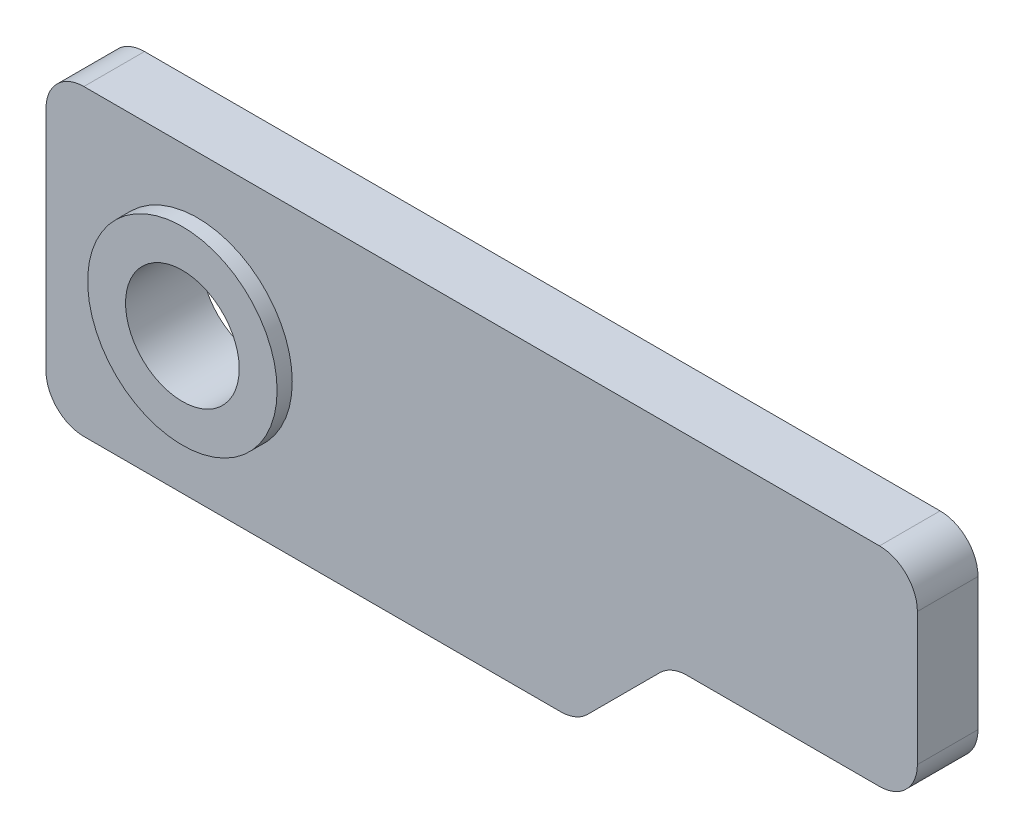
ISO-10303-21;
HEADER;
FILE_DESCRIPTION(('STEP AP214'),'2;1');
FILE_NAME('part.step','',(''),(''),'','','');
FILE_SCHEMA(('AUTOMOTIVE_DESIGN { 1 0 10303 214 1 1 1 1 }'));
ENDSEC;
DATA;
#1=APPLICATION_CONTEXT('core data for automotive mechanical design processes');
#2=APPLICATION_PROTOCOL_DEFINITION('international standard','automotive_design',2000,#1);
#3=PRODUCT_CONTEXT('',#1,'mechanical');
#4=PRODUCT('Part','Part','',(#3));
#5=PRODUCT_RELATED_PRODUCT_CATEGORY('part','',(#4));
#6=PRODUCT_DEFINITION_FORMATION('','',#4);
#7=PRODUCT_DEFINITION_CONTEXT('part definition',#1,'design');
#8=PRODUCT_DEFINITION('design','',#6,#7);
#9=PRODUCT_DEFINITION_SHAPE('','',#8);
#10=(LENGTH_UNIT() NAMED_UNIT(*) SI_UNIT(.MILLI.,.METRE.));
#11=(NAMED_UNIT(*) PLANE_ANGLE_UNIT() SI_UNIT($,.RADIAN.));
#12=(NAMED_UNIT(*) SI_UNIT($,.STERADIAN.) SOLID_ANGLE_UNIT());
#13=UNCERTAINTY_MEASURE_WITH_UNIT(LENGTH_MEASURE(1.E-05),#10,'distance_accuracy_value','');
#14=(GEOMETRIC_REPRESENTATION_CONTEXT(3) GLOBAL_UNCERTAINTY_ASSIGNED_CONTEXT((#13)) GLOBAL_UNIT_ASSIGNED_CONTEXT((#10,
#11,#12)) REPRESENTATION_CONTEXT('',''));
#15=CARTESIAN_POINT('',(0.,0.,0.));
#16=DIRECTION('',(0.,0.,1.));
#17=DIRECTION('',(1.,0.,0.));
#18=AXIS2_PLACEMENT_3D('',#15,#16,#17);
#19=CARTESIAN_POINT('',(0.,0.,2.));
#20=DIRECTION('',(0.,0.,1.));
#21=DIRECTION('',(1.,0.,0.));
#22=AXIS2_PLACEMENT_3D('',#19,#20,#21);
#23=PLANE('',#22);
#24=CARTESIAN_POINT('',(-7.5,0.,2.));
#25=DIRECTION('',(0.,0.,1.));
#26=DIRECTION('',(1.,0.,0.));
#27=AXIS2_PLACEMENT_3D('',#24,#25,#26);
#28=CIRCLE('',#27,1.5);
#29=CARTESIAN_POINT('',(-6.,0.,2.));
#30=VERTEX_POINT('',#29);
#31=EDGE_CURVE('E218',#30,#30,#28,.T.);
#32=ORIENTED_EDGE('',*,*,#31,.F.);
#33=EDGE_LOOP('',(#32));
#34=FACE_BOUND('',#33,.T.);
#35=CARTESIAN_POINT('',(-7.5,0.,2.));
#36=DIRECTION('',(0.,0.,1.));
#37=DIRECTION('',(1.,0.,0.));
#38=AXIS2_PLACEMENT_3D('',#35,#36,#37);
#39=CIRCLE('',#38,2.5);
#40=CARTESIAN_POINT('',(-5.,0.,2.));
#41=VERTEX_POINT('',#40);
#42=EDGE_CURVE('E254',#41,#41,#39,.T.);
#43=ORIENTED_EDGE('',*,*,#42,.T.);
#44=EDGE_LOOP('',(#43));
#45=FACE_BOUND('',#44,.T.);
#46=ADVANCED_FACE('F37',(#34,#45),#23,.T.);
#47=CARTESIAN_POINT('',(-11.5,-4.,2.));
#48=DIRECTION('',(1.,0.,0.));
#49=DIRECTION('',(0.,0.,-1.));
#50=AXIS2_PLACEMENT_3D('',#47,#48,#49);
#51=PLANE('',#50);
#52=DIRECTION('',(0.,-1.,0.));
#53=VECTOR('',#52,1.);
#54=CARTESIAN_POINT('',(-11.5,-4.,0.));
#55=LINE('',#54,#53);
#56=CARTESIAN_POINT('',(-11.5,3.,0.));
#57=VERTEX_POINT('',#56);
#58=CARTESIAN_POINT('',(-11.5,-3.,0.));
#59=VERTEX_POINT('',#58);
#60=EDGE_CURVE('E221',#57,#59,#55,.T.);
#61=ORIENTED_EDGE('',*,*,#60,.T.);
#62=DIRECTION('',(0.,0.,-1.));
#63=VECTOR('',#62,1.);
#64=CARTESIAN_POINT('',(-11.5,-3.,2.));
#65=LINE('',#64,#63);
#66=CARTESIAN_POINT('',(-11.5,-3.,1.6));
#67=VERTEX_POINT('',#66);
#68=EDGE_CURVE('E193',#59,#67,#65,.F.);
#69=ORIENTED_EDGE('',*,*,#68,.T.);
#70=DIRECTION('',(0.,-1.,0.));
#71=VECTOR('',#70,1.);
#72=CARTESIAN_POINT('',(-11.5,4.,1.6));
#73=LINE('',#72,#71);
#74=CARTESIAN_POINT('',(-11.5,3.,1.6));
#75=VERTEX_POINT('',#74);
#76=EDGE_CURVE('E243',#75,#67,#73,.T.);
#77=ORIENTED_EDGE('',*,*,#76,.F.);
#78=DIRECTION('',(0.,0.,-1.));
#79=VECTOR('',#78,1.);
#80=CARTESIAN_POINT('',(-11.5,3.,2.));
#81=LINE('',#80,#79);
#82=EDGE_CURVE('E190',#75,#57,#81,.T.);
#83=ORIENTED_EDGE('',*,*,#82,.T.);
#84=EDGE_LOOP('',(#61,#69,#77,#83));
#85=FACE_BOUND('',#84,.T.);
#86=ADVANCED_FACE('F247',(#85),#51,.F.);
#87=CARTESIAN_POINT('',(2.50000000000001,-4.,2.));
#88=DIRECTION('',(0.,1.,0.));
#89=DIRECTION('',(-1.,0.,0.));
#90=AXIS2_PLACEMENT_3D('',#87,#88,#89);
#91=PLANE('',#90);
#92=DIRECTION('',(1.,0.,0.));
#93=VECTOR('',#92,1.);
#94=CARTESIAN_POINT('',(2.50000000000001,-4.,0.));
#95=LINE('',#94,#93);
#96=CARTESIAN_POINT('',(-10.5,-4.,0.));
#97=VERTEX_POINT('',#96);
#98=CARTESIAN_POINT('',(2.08578643762691,-4.,0.));
#99=VERTEX_POINT('',#98);
#100=EDGE_CURVE('E206',#97,#99,#95,.T.);
#101=ORIENTED_EDGE('',*,*,#100,.T.);
#102=DIRECTION('',(0.,0.,-1.));
#103=VECTOR('',#102,1.);
#104=CARTESIAN_POINT('',(2.08578643762691,-4.,2.));
#105=LINE('',#104,#103);
#106=CARTESIAN_POINT('',(2.08578643762691,-4.,1.6));
#107=VERTEX_POINT('',#106);
#108=EDGE_CURVE('E183',#99,#107,#105,.F.);
#109=ORIENTED_EDGE('',*,*,#108,.T.);
#110=DIRECTION('',(1.,0.,0.));
#111=VECTOR('',#110,1.);
#112=CARTESIAN_POINT('',(-11.5,-4.,1.6));
#113=LINE('',#112,#111);
#114=CARTESIAN_POINT('',(-10.5,-4.,1.6));
#115=VERTEX_POINT('',#114);
#116=EDGE_CURVE('E214',#115,#107,#113,.T.);
#117=ORIENTED_EDGE('',*,*,#116,.F.);
#118=DIRECTION('',(0.,0.,-1.));
#119=VECTOR('',#118,1.);
#120=CARTESIAN_POINT('',(-10.5,-4.,2.));
#121=LINE('',#120,#119);
#122=EDGE_CURVE('E180',#115,#97,#121,.T.);
#123=ORIENTED_EDGE('',*,*,#122,.T.);
#124=EDGE_LOOP('',(#101,#109,#117,#123));
#125=FACE_BOUND('',#124,.T.);
#126=ADVANCED_FACE('F279',(#125),#91,.F.);
#127=CARTESIAN_POINT('',(5.,-1.5,2.));
#128=DIRECTION('',(-0.707106781186549,0.707106781186546,0.));
#129=DIRECTION('',(-0.707106781186546,-0.707106781186549,0.));
#130=AXIS2_PLACEMENT_3D('',#127,#128,#129);
#131=PLANE('',#130);
#132=DIRECTION('',(0.707106781186546,0.707106781186549,0.));
#133=VECTOR('',#132,1.);
#134=CARTESIAN_POINT('',(5.,-1.5,0.));
#135=LINE('',#134,#133);
#136=CARTESIAN_POINT('',(2.79289321881346,-3.70710678118655,0.));
#137=VERTEX_POINT('',#136);
#138=CARTESIAN_POINT('',(4.70710678118655,-1.79289321881345,0.));
#139=VERTEX_POINT('',#138);
#140=EDGE_CURVE('E199',#137,#139,#135,.T.);
#141=ORIENTED_EDGE('',*,*,#140,.T.);
#142=DIRECTION('',(0.,0.,-1.));
#143=VECTOR('',#142,1.);
#144=CARTESIAN_POINT('',(4.70710678118655,-1.79289321881345,1.6));
#145=LINE('',#144,#143);
#146=CARTESIAN_POINT('',(4.70710678118655,-1.79289321881345,1.6));
#147=VERTEX_POINT('',#146);
#148=EDGE_CURVE('E52',#139,#147,#145,.F.);
#149=ORIENTED_EDGE('',*,*,#148,.T.);
#150=DIRECTION('',(0.707106781186546,0.707106781186549,0.));
#151=VECTOR('',#150,1.);
#152=CARTESIAN_POINT('',(2.50000000000001,-4.,1.6));
#153=LINE('',#152,#151);
#154=CARTESIAN_POINT('',(2.79289321881346,-3.70710678118655,1.6));
#155=VERTEX_POINT('',#154);
#156=EDGE_CURVE('E210',#155,#147,#153,.T.);
#157=ORIENTED_EDGE('',*,*,#156,.F.);
#158=DIRECTION('',(0.,0.,-1.));
#159=VECTOR('',#158,1.);
#160=CARTESIAN_POINT('',(2.79289321881346,-3.70710678118655,2.));
#161=LINE('',#160,#159);
#162=EDGE_CURVE('E137',#155,#137,#161,.T.);
#163=ORIENTED_EDGE('',*,*,#162,.T.);
#164=EDGE_LOOP('',(#141,#149,#157,#163));
#165=FACE_BOUND('',#164,.T.);
#166=ADVANCED_FACE('F204',(#165),#131,.F.);
#167=CARTESIAN_POINT('',(11.5,-1.5,2.));
#168=DIRECTION('',(0.,1.,0.));
#169=DIRECTION('',(-1.,0.,0.));
#170=AXIS2_PLACEMENT_3D('',#167,#168,#169);
#171=PLANE('',#170);
#172=DIRECTION('',(1.,0.,0.));
#173=VECTOR('',#172,1.);
#174=CARTESIAN_POINT('',(11.5,-1.5,0.));
#175=LINE('',#174,#173);
#176=CARTESIAN_POINT('',(5.41421356237309,-1.5,0.));
#177=VERTEX_POINT('',#176);
#178=CARTESIAN_POINT('',(10.5,-1.5,0.));
#179=VERTEX_POINT('',#178);
#180=EDGE_CURVE('E201',#177,#179,#175,.T.);
#181=ORIENTED_EDGE('',*,*,#180,.T.);
#182=DIRECTION('',(0.,0.,-1.));
#183=VECTOR('',#182,1.);
#184=CARTESIAN_POINT('',(10.5,-1.5,2.));
#185=LINE('',#184,#183);
#186=CARTESIAN_POINT('',(10.5,-1.5,1.6));
#187=VERTEX_POINT('',#186);
#188=EDGE_CURVE('E168',#179,#187,#185,.F.);
#189=ORIENTED_EDGE('',*,*,#188,.T.);
#190=DIRECTION('',(1.,0.,0.));
#191=VECTOR('',#190,1.);
#192=CARTESIAN_POINT('',(5.,-1.5,1.6));
#193=LINE('',#192,#191);
#194=CARTESIAN_POINT('',(5.41421356237309,-1.5,1.6));
#195=VERTEX_POINT('',#194);
#196=EDGE_CURVE('E133',#195,#187,#193,.T.);
#197=ORIENTED_EDGE('',*,*,#196,.F.);
#198=DIRECTION('',(0.,0.,-1.));
#199=VECTOR('',#198,1.);
#200=CARTESIAN_POINT('',(5.41421356237309,-1.5,0.));
#201=LINE('',#200,#199);
#202=EDGE_CURVE('E165',#195,#177,#201,.T.);
#203=ORIENTED_EDGE('',*,*,#202,.T.);
#204=EDGE_LOOP('',(#181,#189,#197,#203));
#205=FACE_BOUND('',#204,.T.);
#206=ADVANCED_FACE('F212',(#205),#171,.F.);
#207=CARTESIAN_POINT('',(11.5,-1.5,2.));
#208=DIRECTION('',(-1.,0.,0.));
#209=DIRECTION('',(0.,0.,1.));
#210=AXIS2_PLACEMENT_3D('',#207,#208,#209);
#211=PLANE('',#210);
#212=DIRECTION('',(0.,1.,0.));
#213=VECTOR('',#212,1.);
#214=CARTESIAN_POINT('',(11.5,-1.5,1.6));
#215=LINE('',#214,#213);
#216=CARTESIAN_POINT('',(11.5,-0.499999999999997,1.6));
#217=VERTEX_POINT('',#216);
#218=CARTESIAN_POINT('',(11.5,3.,1.6));
#219=VERTEX_POINT('',#218);
#220=EDGE_CURVE('E130',#217,#219,#215,.T.);
#221=ORIENTED_EDGE('',*,*,#220,.F.);
#222=DIRECTION('',(0.,0.,-1.));
#223=VECTOR('',#222,1.);
#224=CARTESIAN_POINT('',(11.5,-0.499999999999997,2.));
#225=LINE('',#224,#223);
#226=CARTESIAN_POINT('',(11.5,-0.499999999999997,0.));
#227=VERTEX_POINT('',#226);
#228=EDGE_CURVE('E143',#217,#227,#225,.T.);
#229=ORIENTED_EDGE('',*,*,#228,.T.);
#230=DIRECTION('',(0.,1.,0.));
#231=VECTOR('',#230,1.);
#232=CARTESIAN_POINT('',(11.5,-1.5,0.));
#233=LINE('',#232,#231);
#234=CARTESIAN_POINT('',(11.5,3.,0.));
#235=VERTEX_POINT('',#234);
#236=EDGE_CURVE('E229',#227,#235,#233,.T.);
#237=ORIENTED_EDGE('',*,*,#236,.T.);
#238=DIRECTION('',(0.,0.,-1.));
#239=VECTOR('',#238,1.);
#240=CARTESIAN_POINT('',(11.5,3.,2.));
#241=LINE('',#240,#239);
#242=EDGE_CURVE('E146',#235,#219,#241,.F.);
#243=ORIENTED_EDGE('',*,*,#242,.T.);
#244=EDGE_LOOP('',(#221,#229,#237,#243));
#245=FACE_BOUND('',#244,.T.);
#246=ADVANCED_FACE('F141',(#245),#211,.F.);
#247=CARTESIAN_POINT('',(11.5,4.,2.));
#248=DIRECTION('',(0.,-1.,0.));
#249=DIRECTION('',(1.,0.,0.));
#250=AXIS2_PLACEMENT_3D('',#247,#248,#249);
#251=PLANE('',#250);
#252=DIRECTION('',(-1.,0.,0.));
#253=VECTOR('',#252,1.);
#254=CARTESIAN_POINT('',(11.5,4.,1.6));
#255=LINE('',#254,#253);
#256=CARTESIAN_POINT('',(10.5,4.,1.6));
#257=VERTEX_POINT('',#256);
#258=CARTESIAN_POINT('',(-10.5,4.,1.6));
#259=VERTEX_POINT('',#258);
#260=EDGE_CURVE('E245',#257,#259,#255,.T.);
#261=ORIENTED_EDGE('',*,*,#260,.F.);
#262=DIRECTION('',(0.,0.,-1.));
#263=VECTOR('',#262,1.);
#264=CARTESIAN_POINT('',(10.5,4.,2.));
#265=LINE('',#264,#263);
#266=CARTESIAN_POINT('',(10.5,4.,0.));
#267=VERTEX_POINT('',#266);
#268=EDGE_CURVE('E187',#257,#267,#265,.T.);
#269=ORIENTED_EDGE('',*,*,#268,.T.);
#270=DIRECTION('',(-1.,0.,0.));
#271=VECTOR('',#270,1.);
#272=CARTESIAN_POINT('',(11.5,4.,0.));
#273=LINE('',#272,#271);
#274=CARTESIAN_POINT('',(-10.5,4.,0.));
#275=VERTEX_POINT('',#274);
#276=EDGE_CURVE('E155',#267,#275,#273,.T.);
#277=ORIENTED_EDGE('',*,*,#276,.T.);
#278=DIRECTION('',(0.,0.,-1.));
#279=VECTOR('',#278,1.);
#280=CARTESIAN_POINT('',(-10.5,4.,2.));
#281=LINE('',#280,#279);
#282=EDGE_CURVE('E185',#275,#259,#281,.F.);
#283=ORIENTED_EDGE('',*,*,#282,.T.);
#284=EDGE_LOOP('',(#261,#269,#277,#283));
#285=FACE_BOUND('',#284,.T.);
#286=ADVANCED_FACE('F235',(#285),#251,.F.);
#287=CARTESIAN_POINT('',(0.,0.,0.));
#288=DIRECTION('',(0.,0.,1.));
#289=DIRECTION('',(1.,0.,0.));
#290=AXIS2_PLACEMENT_3D('',#287,#288,#289);
#291=PLANE('',#290);
#292=ORIENTED_EDGE('',*,*,#236,.F.);
#293=CARTESIAN_POINT('',(10.5,-0.499999999999997,0.));
#294=DIRECTION('',(0.,0.,1.));
#295=DIRECTION('',(1.,0.,0.));
#296=AXIS2_PLACEMENT_3D('',#293,#294,#295);
#297=CIRCLE('',#296,1.);
#298=EDGE_CURVE('E150',#227,#179,#297,.F.);
#299=ORIENTED_EDGE('',*,*,#298,.T.);
#300=ORIENTED_EDGE('',*,*,#180,.F.);
#301=CARTESIAN_POINT('',(5.41421356237309,-2.5,0.));
#302=DIRECTION('',(0.,0.,1.));
#303=DIRECTION('',(1.,0.,0.));
#304=AXIS2_PLACEMENT_3D('',#301,#302,#303);
#305=CIRCLE('',#304,1.);
#306=EDGE_CURVE('E45',#177,#139,#305,.T.);
#307=ORIENTED_EDGE('',*,*,#306,.T.);
#308=ORIENTED_EDGE('',*,*,#140,.F.);
#309=CARTESIAN_POINT('',(2.08578643762691,-3.,0.));
#310=DIRECTION('',(0.,0.,1.));
#311=DIRECTION('',(1.,0.,0.));
#312=AXIS2_PLACEMENT_3D('',#309,#310,#311);
#313=CIRCLE('',#312,1.);
#314=EDGE_CURVE('E162',#137,#99,#313,.F.);
#315=ORIENTED_EDGE('',*,*,#314,.T.);
#316=ORIENTED_EDGE('',*,*,#100,.F.);
#317=CARTESIAN_POINT('',(-10.5,-3.,0.));
#318=DIRECTION('',(0.,0.,1.));
#319=DIRECTION('',(1.,0.,0.));
#320=AXIS2_PLACEMENT_3D('',#317,#318,#319);
#321=CIRCLE('',#320,1.);
#322=EDGE_CURVE('E153',#97,#59,#321,.F.);
#323=ORIENTED_EDGE('',*,*,#322,.T.);
#324=ORIENTED_EDGE('',*,*,#60,.F.);
#325=CARTESIAN_POINT('',(-10.5,3.,0.));
#326=DIRECTION('',(0.,0.,1.));
#327=DIRECTION('',(1.,0.,0.));
#328=AXIS2_PLACEMENT_3D('',#325,#326,#327);
#329=CIRCLE('',#328,1.);
#330=EDGE_CURVE('E151',#57,#275,#329,.F.);
#331=ORIENTED_EDGE('',*,*,#330,.T.);
#332=ORIENTED_EDGE('',*,*,#276,.F.);
#333=CARTESIAN_POINT('',(10.5,3.,0.));
#334=DIRECTION('',(0.,0.,1.));
#335=DIRECTION('',(1.,0.,0.));
#336=AXIS2_PLACEMENT_3D('',#333,#334,#335);
#337=CIRCLE('',#336,1.);
#338=EDGE_CURVE('E160',#267,#235,#337,.F.);
#339=ORIENTED_EDGE('',*,*,#338,.T.);
#340=EDGE_LOOP('',(#292,#299,#300,#307,#308,#315,#316,#323,#324,#331,#332,#339));
#341=FACE_BOUND('',#340,.T.);
#342=CARTESIAN_POINT('',(-7.5,0.,0.));
#343=DIRECTION('',(0.,0.,1.));
#344=DIRECTION('',(1.,0.,0.));
#345=AXIS2_PLACEMENT_3D('',#342,#343,#344);
#346=CIRCLE('',#345,1.5);
#347=CARTESIAN_POINT('',(-6.,0.,0.));
#348=VERTEX_POINT('',#347);
#349=EDGE_CURVE('E147',#348,#348,#346,.T.);
#350=ORIENTED_EDGE('',*,*,#349,.T.);
#351=EDGE_LOOP('',(#350));
#352=FACE_BOUND('',#351,.T.);
#353=ADVANCED_FACE('F197',(#341,#352),#291,.F.);
#354=CARTESIAN_POINT('',(-7.5,0.,2.));
#355=DIRECTION('',(0.,0.,-1.));
#356=DIRECTION('',(-1.,0.,0.));
#357=AXIS2_PLACEMENT_3D('',#354,#355,#356);
#358=CYLINDRICAL_SURFACE('',#357,1.5);
#359=ORIENTED_EDGE('',*,*,#31,.T.);
#360=EDGE_LOOP('',(#359));
#361=FACE_BOUND('',#360,.T.);
#362=ORIENTED_EDGE('',*,*,#349,.F.);
#363=EDGE_LOOP('',(#362));
#364=FACE_BOUND('',#363,.T.);
#365=ADVANCED_FACE('F264',(#361,#364),#358,.F.);
#366=CARTESIAN_POINT('',(0.,0.,1.6));
#367=DIRECTION('',(0.,0.,1.));
#368=DIRECTION('',(1.,0.,0.));
#369=AXIS2_PLACEMENT_3D('',#366,#367,#368);
#370=PLANE('',#369);
#371=CARTESIAN_POINT('',(-7.5,0.,1.6));
#372=DIRECTION('',(0.,0.,1.));
#373=DIRECTION('',(1.,0.,0.));
#374=AXIS2_PLACEMENT_3D('',#371,#372,#373);
#375=CIRCLE('',#374,2.5);
#376=CARTESIAN_POINT('',(-5.,0.,1.6));
#377=VERTEX_POINT('',#376);
#378=EDGE_CURVE('E251',#377,#377,#375,.T.);
#379=ORIENTED_EDGE('',*,*,#378,.F.);
#380=EDGE_LOOP('',(#379));
#381=FACE_BOUND('',#380,.T.);
#382=ORIENTED_EDGE('',*,*,#196,.T.);
#383=CARTESIAN_POINT('',(10.5,-0.499999999999997,1.6));
#384=DIRECTION('',(0.,0.,1.));
#385=DIRECTION('',(1.,0.,0.));
#386=AXIS2_PLACEMENT_3D('',#383,#384,#385);
#387=CIRCLE('',#386,1.);
#388=EDGE_CURVE('E127',#187,#217,#387,.T.);
#389=ORIENTED_EDGE('',*,*,#388,.T.);
#390=ORIENTED_EDGE('',*,*,#220,.T.);
#391=CARTESIAN_POINT('',(10.5,3.,1.6));
#392=DIRECTION('',(0.,0.,1.));
#393=DIRECTION('',(1.,0.,0.));
#394=AXIS2_PLACEMENT_3D('',#391,#392,#393);
#395=CIRCLE('',#394,1.);
#396=EDGE_CURVE('E174',#219,#257,#395,.T.);
#397=ORIENTED_EDGE('',*,*,#396,.T.);
#398=ORIENTED_EDGE('',*,*,#260,.T.);
#399=CARTESIAN_POINT('',(-10.5,3.,1.6));
#400=DIRECTION('',(0.,0.,1.));
#401=DIRECTION('',(1.,0.,0.));
#402=AXIS2_PLACEMENT_3D('',#399,#400,#401);
#403=CIRCLE('',#402,1.);
#404=EDGE_CURVE('E170',#259,#75,#403,.T.);
#405=ORIENTED_EDGE('',*,*,#404,.T.);
#406=ORIENTED_EDGE('',*,*,#76,.T.);
#407=CARTESIAN_POINT('',(-10.5,-3.,1.6));
#408=DIRECTION('',(0.,0.,1.));
#409=DIRECTION('',(1.,0.,0.));
#410=AXIS2_PLACEMENT_3D('',#407,#408,#409);
#411=CIRCLE('',#410,1.);
#412=EDGE_CURVE('E172',#67,#115,#411,.T.);
#413=ORIENTED_EDGE('',*,*,#412,.T.);
#414=ORIENTED_EDGE('',*,*,#116,.T.);
#415=CARTESIAN_POINT('',(2.08578643762691,-3.,1.6));
#416=DIRECTION('',(0.,0.,1.));
#417=DIRECTION('',(1.,0.,0.));
#418=AXIS2_PLACEMENT_3D('',#415,#416,#417);
#419=CIRCLE('',#418,1.);
#420=EDGE_CURVE('E59',#107,#155,#419,.T.);
#421=ORIENTED_EDGE('',*,*,#420,.T.);
#422=ORIENTED_EDGE('',*,*,#156,.T.);
#423=CARTESIAN_POINT('',(5.41421356237309,-2.5,1.6));
#424=DIRECTION('',(0.,0.,1.));
#425=DIRECTION('',(1.,0.,0.));
#426=AXIS2_PLACEMENT_3D('',#423,#424,#425);
#427=CIRCLE('',#426,1.);
#428=EDGE_CURVE('E11',#147,#195,#427,.F.);
#429=ORIENTED_EDGE('',*,*,#428,.T.);
#430=EDGE_LOOP('',(#382,#389,#390,#397,#398,#405,#406,#413,#414,#421,#422,#429));
#431=FACE_BOUND('',#430,.T.);
#432=ADVANCED_FACE('F129',(#381,#431),#370,.T.);
#433=CARTESIAN_POINT('',(-7.5,0.,1.6));
#434=DIRECTION('',(0.,0.,1.));
#435=DIRECTION('',(1.,0.,0.));
#436=AXIS2_PLACEMENT_3D('',#433,#434,#435);
#437=CYLINDRICAL_SURFACE('',#436,2.5);
#438=ORIENTED_EDGE('',*,*,#378,.T.);
#439=EDGE_LOOP('',(#438));
#440=FACE_BOUND('',#439,.T.);
#441=ORIENTED_EDGE('',*,*,#42,.F.);
#442=EDGE_LOOP('',(#441));
#443=FACE_BOUND('',#442,.T.);
#444=ADVANCED_FACE('F260',(#440,#443),#437,.T.);
#445=CARTESIAN_POINT('',(10.5,-0.499999999999997,2.));
#446=DIRECTION('',(0.,0.,-1.));
#447=DIRECTION('',(-1.,0.,0.));
#448=AXIS2_PLACEMENT_3D('',#445,#446,#447);
#449=CYLINDRICAL_SURFACE('',#448,1.);
#450=ORIENTED_EDGE('',*,*,#388,.F.);
#451=ORIENTED_EDGE('',*,*,#188,.F.);
#452=ORIENTED_EDGE('',*,*,#298,.F.);
#453=ORIENTED_EDGE('',*,*,#228,.F.);
#454=EDGE_LOOP('',(#450,#451,#452,#453));
#455=FACE_BOUND('',#454,.T.);
#456=ADVANCED_FACE('F149',(#455),#449,.T.);
#457=CARTESIAN_POINT('',(5.41421356237309,-2.5,2.));
#458=DIRECTION('',(0.,0.,1.));
#459=DIRECTION('',(1.,0.,0.));
#460=AXIS2_PLACEMENT_3D('',#457,#458,#459);
#461=CYLINDRICAL_SURFACE('',#460,1.);
#462=ORIENTED_EDGE('',*,*,#428,.F.);
#463=ORIENTED_EDGE('',*,*,#148,.F.);
#464=ORIENTED_EDGE('',*,*,#306,.F.);
#465=ORIENTED_EDGE('',*,*,#202,.F.);
#466=EDGE_LOOP('',(#462,#463,#464,#465));
#467=FACE_BOUND('',#466,.T.);
#468=ADVANCED_FACE('F209',(#467),#461,.F.);
#469=CARTESIAN_POINT('',(2.08578643762691,-3.,2.));
#470=DIRECTION('',(0.,0.,-1.));
#471=DIRECTION('',(-1.,0.,0.));
#472=AXIS2_PLACEMENT_3D('',#469,#470,#471);
#473=CYLINDRICAL_SURFACE('',#472,1.);
#474=ORIENTED_EDGE('',*,*,#420,.F.);
#475=ORIENTED_EDGE('',*,*,#108,.F.);
#476=ORIENTED_EDGE('',*,*,#314,.F.);
#477=ORIENTED_EDGE('',*,*,#162,.F.);
#478=EDGE_LOOP('',(#474,#475,#476,#477));
#479=FACE_BOUND('',#478,.T.);
#480=ADVANCED_FACE('F301',(#479),#473,.T.);
#481=CARTESIAN_POINT('',(10.5,3.,2.));
#482=DIRECTION('',(0.,0.,-1.));
#483=DIRECTION('',(-1.,0.,0.));
#484=AXIS2_PLACEMENT_3D('',#481,#482,#483);
#485=CYLINDRICAL_SURFACE('',#484,1.);
#486=ORIENTED_EDGE('',*,*,#396,.F.);
#487=ORIENTED_EDGE('',*,*,#242,.F.);
#488=ORIENTED_EDGE('',*,*,#338,.F.);
#489=ORIENTED_EDGE('',*,*,#268,.F.);
#490=EDGE_LOOP('',(#486,#487,#488,#489));
#491=FACE_BOUND('',#490,.T.);
#492=ADVANCED_FACE('F304',(#491),#485,.T.);
#493=CARTESIAN_POINT('',(-10.5,-3.,2.));
#494=DIRECTION('',(0.,0.,-1.));
#495=DIRECTION('',(-1.,0.,0.));
#496=AXIS2_PLACEMENT_3D('',#493,#494,#495);
#497=CYLINDRICAL_SURFACE('',#496,1.);
#498=ORIENTED_EDGE('',*,*,#412,.F.);
#499=ORIENTED_EDGE('',*,*,#68,.F.);
#500=ORIENTED_EDGE('',*,*,#322,.F.);
#501=ORIENTED_EDGE('',*,*,#122,.F.);
#502=EDGE_LOOP('',(#498,#499,#500,#501));
#503=FACE_BOUND('',#502,.T.);
#504=ADVANCED_FACE('F307',(#503),#497,.T.);
#505=CARTESIAN_POINT('',(-10.5,3.,2.));
#506=DIRECTION('',(0.,0.,-1.));
#507=DIRECTION('',(-1.,0.,0.));
#508=AXIS2_PLACEMENT_3D('',#505,#506,#507);
#509=CYLINDRICAL_SURFACE('',#508,1.);
#510=ORIENTED_EDGE('',*,*,#404,.F.);
#511=ORIENTED_EDGE('',*,*,#282,.F.);
#512=ORIENTED_EDGE('',*,*,#330,.F.);
#513=ORIENTED_EDGE('',*,*,#82,.F.);
#514=EDGE_LOOP('',(#510,#511,#512,#513));
#515=FACE_BOUND('',#514,.T.);
#516=ADVANCED_FACE('F39',(#515),#509,.T.);
#517=CLOSED_SHELL('',(#46,#86,#126,#166,#206,#246,#286,#353,#365,#432,#444,#456,#468,#480,#492,
#504,#516));
#518=MANIFOLD_SOLID_BREP('B2',#517);
#519=ADVANCED_BREP_SHAPE_REPRESENTATION('',(#18,#518),#14);
#520=SHAPE_DEFINITION_REPRESENTATION(#9,#519);
ENDSEC;
END-ISO-10303-21;
